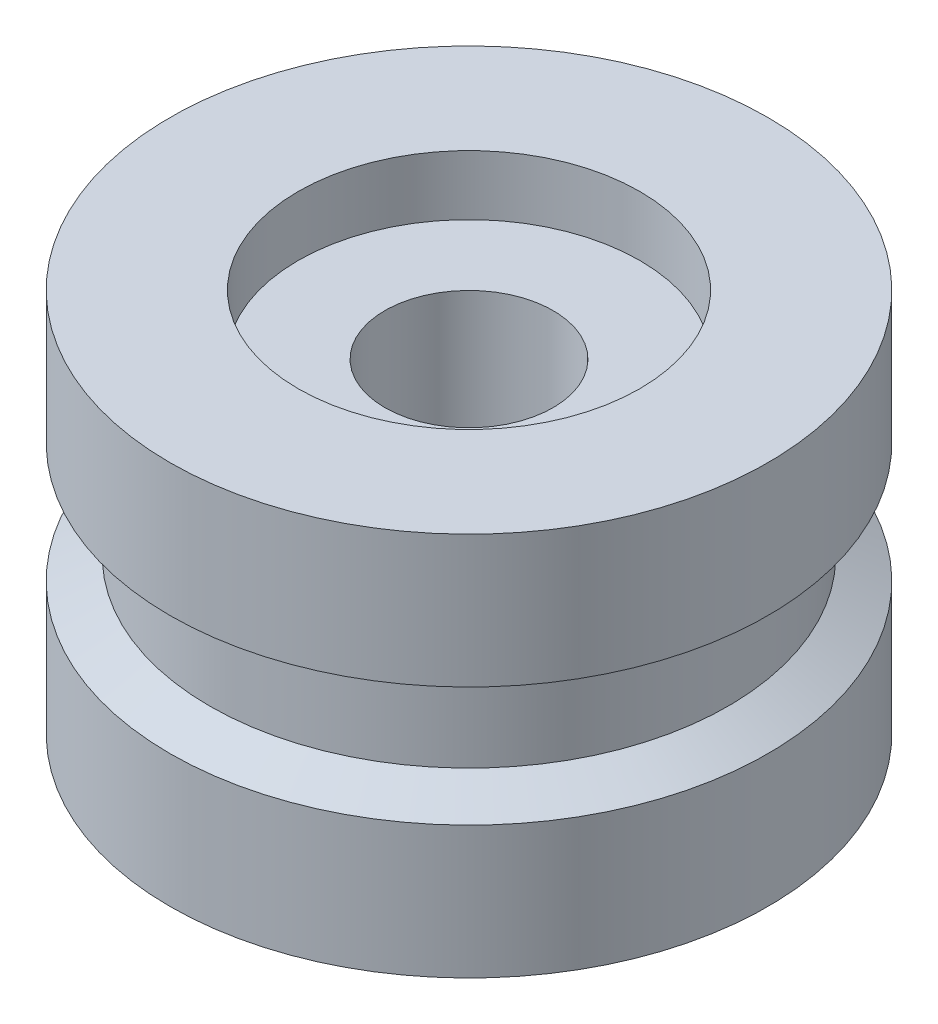
ISO-10303-21;
HEADER;
FILE_DESCRIPTION(('STEP AP214'),'2;1');
FILE_NAME('part.step','',(''),(''),'','','');
FILE_SCHEMA(('AUTOMOTIVE_DESIGN { 1 0 10303 214 1 1 1 1 }'));
ENDSEC;
DATA;
#1=APPLICATION_CONTEXT('core data for automotive mechanical design processes');
#2=APPLICATION_PROTOCOL_DEFINITION('international standard','automotive_design',2000,#1);
#3=PRODUCT_CONTEXT('',#1,'mechanical');
#4=PRODUCT('Part','Part','',(#3));
#5=PRODUCT_RELATED_PRODUCT_CATEGORY('part','',(#4));
#6=PRODUCT_DEFINITION_FORMATION('','',#4);
#7=PRODUCT_DEFINITION_CONTEXT('part definition',#1,'design');
#8=PRODUCT_DEFINITION('design','',#6,#7);
#9=PRODUCT_DEFINITION_SHAPE('','',#8);
#10=(LENGTH_UNIT() NAMED_UNIT(*) SI_UNIT(.MILLI.,.METRE.));
#11=(NAMED_UNIT(*) PLANE_ANGLE_UNIT() SI_UNIT($,.RADIAN.));
#12=(NAMED_UNIT(*) SI_UNIT($,.STERADIAN.) SOLID_ANGLE_UNIT());
#13=UNCERTAINTY_MEASURE_WITH_UNIT(LENGTH_MEASURE(1.E-05),#10,'distance_accuracy_value','');
#14=(GEOMETRIC_REPRESENTATION_CONTEXT(3) GLOBAL_UNCERTAINTY_ASSIGNED_CONTEXT((#13)) GLOBAL_UNIT_ASSIGNED_CONTEXT((#10,
#11,#12)) REPRESENTATION_CONTEXT('',''));
#15=CARTESIAN_POINT('',(0.,0.,0.));
#16=DIRECTION('',(0.,0.,1.));
#17=DIRECTION('',(1.,0.,0.));
#18=AXIS2_PLACEMENT_3D('',#15,#16,#17);
#19=CARTESIAN_POINT('',(0.,-15.5,0.));
#20=DIRECTION('',(0.,1.,0.));
#21=DIRECTION('',(0.,0.,1.));
#22=AXIS2_PLACEMENT_3D('',#19,#20,#21);
#23=PLANE('',#22);
#24=CARTESIAN_POINT('',(0.,-15.5,0.));
#25=DIRECTION('',(0.,1.,0.));
#26=DIRECTION('',(0.,0.,1.));
#27=AXIS2_PLACEMENT_3D('',#24,#25,#26);
#28=CIRCLE('',#27,9.85);
#29=CARTESIAN_POINT('',(0.,-15.5,9.85));
#30=VERTEX_POINT('',#29);
#31=EDGE_CURVE('E35',#30,#30,#28,.T.);
#32=ORIENTED_EDGE('',*,*,#31,.T.);
#33=EDGE_LOOP('',(#32));
#34=FACE_BOUND('',#33,.T.);
#35=CARTESIAN_POINT('',(0.,-15.5,0.));
#36=DIRECTION('',(0.,1.,0.));
#37=DIRECTION('',(0.,0.,1.));
#38=AXIS2_PLACEMENT_3D('',#35,#36,#37);
#39=CIRCLE('',#38,20.);
#40=CARTESIAN_POINT('',(0.,-15.5,20.));
#41=VERTEX_POINT('',#40);
#42=EDGE_CURVE('E10',#41,#41,#39,.T.);
#43=ORIENTED_EDGE('',*,*,#42,.F.);
#44=EDGE_LOOP('',(#43));
#45=FACE_BOUND('',#44,.T.);
#46=ADVANCED_FACE('F31',(#34,#45),#23,.F.);
#47=CARTESIAN_POINT('',(0.,15.5,0.));
#48=DIRECTION('',(0.,1.,0.));
#49=DIRECTION('',(0.,0.,1.));
#50=AXIS2_PLACEMENT_3D('',#47,#48,#49);
#51=PLANE('',#50);
#52=CARTESIAN_POINT('',(0.,15.5,0.));
#53=DIRECTION('',(0.,1.,0.));
#54=DIRECTION('',(0.,0.,1.));
#55=AXIS2_PLACEMENT_3D('',#52,#53,#54);
#56=CIRCLE('',#55,9.85);
#57=CARTESIAN_POINT('',(0.,15.5,9.85));
#58=VERTEX_POINT('',#57);
#59=EDGE_CURVE('E39',#58,#58,#56,.T.);
#60=ORIENTED_EDGE('',*,*,#59,.F.);
#61=EDGE_LOOP('',(#60));
#62=FACE_BOUND('',#61,.T.);
#63=CARTESIAN_POINT('',(0.,15.5,0.));
#64=DIRECTION('',(0.,1.,0.));
#65=DIRECTION('',(0.,0.,1.));
#66=AXIS2_PLACEMENT_3D('',#63,#64,#65);
#67=CIRCLE('',#66,20.);
#68=CARTESIAN_POINT('',(0.,15.5,20.));
#69=VERTEX_POINT('',#68);
#70=EDGE_CURVE('E51',#69,#69,#67,.T.);
#71=ORIENTED_EDGE('',*,*,#70,.T.);
#72=EDGE_LOOP('',(#71));
#73=FACE_BOUND('',#72,.T.);
#74=ADVANCED_FACE('F93',(#62,#73),#51,.T.);
#75=CARTESIAN_POINT('',(0.,15.5,0.));
#76=DIRECTION('',(0.,-1.,0.));
#77=DIRECTION('',(0.,0.,-1.));
#78=AXIS2_PLACEMENT_3D('',#75,#76,#77);
#79=CYLINDRICAL_SURFACE('',#78,35.);
#80=CARTESIAN_POINT('',(0.,-7.,0.));
#81=DIRECTION('',(0.,1.,0.));
#82=DIRECTION('',(0.,0.,1.));
#83=AXIS2_PLACEMENT_3D('',#80,#81,#82);
#84=CIRCLE('',#83,35.);
#85=CARTESIAN_POINT('',(0.,-7.,35.));
#86=VERTEX_POINT('',#85);
#87=EDGE_CURVE('E69',#86,#86,#84,.T.);
#88=ORIENTED_EDGE('',*,*,#87,.F.);
#89=EDGE_LOOP('',(#88));
#90=FACE_BOUND('',#89,.T.);
#91=CARTESIAN_POINT('',(0.,-22.5,0.));
#92=DIRECTION('',(0.,1.,0.));
#93=DIRECTION('',(0.,0.,1.));
#94=AXIS2_PLACEMENT_3D('',#91,#92,#93);
#95=CIRCLE('',#94,35.);
#96=CARTESIAN_POINT('',(0.,-22.5,35.));
#97=VERTEX_POINT('',#96);
#98=EDGE_CURVE('E48',#97,#97,#95,.T.);
#99=ORIENTED_EDGE('',*,*,#98,.T.);
#100=EDGE_LOOP('',(#99));
#101=FACE_BOUND('',#100,.T.);
#102=ADVANCED_FACE('F33',(#90,#101),#79,.T.);
#103=CARTESIAN_POINT('',(0.,7.,0.));
#104=DIRECTION('',(0.,1.,0.));
#105=DIRECTION('',(0.,0.,1.));
#106=AXIS2_PLACEMENT_3D('',#103,#104,#105);
#107=CIRCLE('',#106,35.);
#108=CARTESIAN_POINT('',(0.,7.,35.));
#109=VERTEX_POINT('',#108);
#110=EDGE_CURVE('E66',#109,#109,#107,.T.);
#111=ORIENTED_EDGE('',*,*,#110,.T.);
#112=EDGE_LOOP('',(#111));
#113=FACE_BOUND('',#112,.T.);
#114=CARTESIAN_POINT('',(0.,22.5,0.));
#115=DIRECTION('',(0.,1.,0.));
#116=DIRECTION('',(0.,0.,1.));
#117=AXIS2_PLACEMENT_3D('',#114,#115,#116);
#118=CIRCLE('',#117,35.);
#119=CARTESIAN_POINT('',(0.,22.5,35.));
#120=VERTEX_POINT('',#119);
#121=EDGE_CURVE('E57',#120,#120,#118,.T.);
#122=ORIENTED_EDGE('',*,*,#121,.F.);
#123=EDGE_LOOP('',(#122));
#124=FACE_BOUND('',#123,.T.);
#125=ADVANCED_FACE('F81',(#113,#124),#79,.T.);
#126=CARTESIAN_POINT('',(0.,15.5,0.));
#127=DIRECTION('',(0.,-1.,0.));
#128=DIRECTION('',(0.,0.,-1.));
#129=AXIS2_PLACEMENT_3D('',#126,#127,#128);
#130=CYLINDRICAL_SURFACE('',#129,9.85);
#131=ORIENTED_EDGE('',*,*,#59,.T.);
#132=EDGE_LOOP('',(#131));
#133=FACE_BOUND('',#132,.T.);
#134=ORIENTED_EDGE('',*,*,#31,.F.);
#135=EDGE_LOOP('',(#134));
#136=FACE_BOUND('',#135,.T.);
#137=ADVANCED_FACE('F78',(#133,#136),#130,.F.);
#138=CARTESIAN_POINT('',(0.,-4.5,0.));
#139=DIRECTION('',(0.,-1.,0.));
#140=DIRECTION('',(0.,0.,-1.));
#141=AXIS2_PLACEMENT_3D('',#138,#139,#140);
#142=CONICAL_SURFACE('',#141,30.36,1.07659795453993);
#143=ORIENTED_EDGE('',*,*,#87,.T.);
#144=EDGE_LOOP('',(#143));
#145=FACE_BOUND('',#144,.T.);
#146=CARTESIAN_POINT('',(0.,-4.5,0.));
#147=DIRECTION('',(0.,1.,0.));
#148=DIRECTION('',(0.,0.,1.));
#149=AXIS2_PLACEMENT_3D('',#146,#147,#148);
#150=CIRCLE('',#149,30.36);
#151=CARTESIAN_POINT('',(0.,-4.5,30.36));
#152=VERTEX_POINT('',#151);
#153=EDGE_CURVE('E60',#152,#152,#150,.T.);
#154=ORIENTED_EDGE('',*,*,#153,.F.);
#155=EDGE_LOOP('',(#154));
#156=FACE_BOUND('',#155,.T.);
#157=ADVANCED_FACE('F80',(#145,#156),#142,.T.);
#158=CARTESIAN_POINT('',(0.,7.,0.));
#159=DIRECTION('',(0.,1.,0.));
#160=DIRECTION('',(0.,0.,1.));
#161=AXIS2_PLACEMENT_3D('',#158,#159,#160);
#162=CONICAL_SURFACE('',#161,35.,1.07659795453993);
#163=CARTESIAN_POINT('',(0.,4.5,0.));
#164=DIRECTION('',(0.,1.,0.));
#165=DIRECTION('',(0.,0.,1.));
#166=AXIS2_PLACEMENT_3D('',#163,#164,#165);
#167=CIRCLE('',#166,30.36);
#168=CARTESIAN_POINT('',(0.,4.5,30.36));
#169=VERTEX_POINT('',#168);
#170=EDGE_CURVE('E63',#169,#169,#167,.T.);
#171=ORIENTED_EDGE('',*,*,#170,.T.);
#172=EDGE_LOOP('',(#171));
#173=FACE_BOUND('',#172,.T.);
#174=ORIENTED_EDGE('',*,*,#110,.F.);
#175=EDGE_LOOP('',(#174));
#176=FACE_BOUND('',#175,.T.);
#177=ADVANCED_FACE('F88',(#173,#176),#162,.T.);
#178=CARTESIAN_POINT('',(0.,15.5,0.));
#179=DIRECTION('',(0.,1.,0.));
#180=DIRECTION('',(0.,0.,1.));
#181=AXIS2_PLACEMENT_3D('',#178,#179,#180);
#182=CYLINDRICAL_SURFACE('',#181,30.36);
#183=ORIENTED_EDGE('',*,*,#170,.F.);
#184=EDGE_LOOP('',(#183));
#185=FACE_BOUND('',#184,.T.);
#186=ORIENTED_EDGE('',*,*,#153,.T.);
#187=EDGE_LOOP('',(#186));
#188=FACE_BOUND('',#187,.T.);
#189=ADVANCED_FACE('F119',(#185,#188),#182,.T.);
#190=CARTESIAN_POINT('',(0.,22.5,35.));
#191=DIRECTION('',(0.,1.,0.));
#192=DIRECTION('',(0.,0.,1.));
#193=AXIS2_PLACEMENT_3D('',#190,#191,#192);
#194=PLANE('',#193);
#195=ORIENTED_EDGE('',*,*,#121,.T.);
#196=EDGE_LOOP('',(#195));
#197=FACE_BOUND('',#196,.T.);
#198=CARTESIAN_POINT('',(0.,22.5,0.));
#199=DIRECTION('',(0.,1.,0.));
#200=DIRECTION('',(0.,0.,1.));
#201=AXIS2_PLACEMENT_3D('',#198,#199,#200);
#202=CIRCLE('',#201,20.);
#203=CARTESIAN_POINT('',(0.,22.5,20.));
#204=VERTEX_POINT('',#203);
#205=EDGE_CURVE('E54',#204,#204,#202,.T.);
#206=ORIENTED_EDGE('',*,*,#205,.F.);
#207=EDGE_LOOP('',(#206));
#208=FACE_BOUND('',#207,.T.);
#209=ADVANCED_FACE('F109',(#197,#208),#194,.T.);
#210=CARTESIAN_POINT('',(0.,15.5,0.));
#211=DIRECTION('',(0.,1.,0.));
#212=DIRECTION('',(0.,0.,1.));
#213=AXIS2_PLACEMENT_3D('',#210,#211,#212);
#214=CYLINDRICAL_SURFACE('',#213,20.);
#215=ORIENTED_EDGE('',*,*,#205,.T.);
#216=EDGE_LOOP('',(#215));
#217=FACE_BOUND('',#216,.T.);
#218=ORIENTED_EDGE('',*,*,#70,.F.);
#219=EDGE_LOOP('',(#218));
#220=FACE_BOUND('',#219,.T.);
#221=ADVANCED_FACE('F106',(#217,#220),#214,.F.);
#222=CARTESIAN_POINT('',(0.,-22.5,35.));
#223=DIRECTION('',(0.,-1.,0.));
#224=DIRECTION('',(0.,0.,-1.));
#225=AXIS2_PLACEMENT_3D('',#222,#223,#224);
#226=PLANE('',#225);
#227=CARTESIAN_POINT('',(0.,-22.5,0.));
#228=DIRECTION('',(0.,1.,0.));
#229=DIRECTION('',(0.,0.,1.));
#230=AXIS2_PLACEMENT_3D('',#227,#228,#229);
#231=CIRCLE('',#230,20.);
#232=CARTESIAN_POINT('',(0.,-22.5,20.));
#233=VERTEX_POINT('',#232);
#234=EDGE_CURVE('E45',#233,#233,#231,.T.);
#235=ORIENTED_EDGE('',*,*,#234,.T.);
#236=EDGE_LOOP('',(#235));
#237=FACE_BOUND('',#236,.T.);
#238=ORIENTED_EDGE('',*,*,#98,.F.);
#239=EDGE_LOOP('',(#238));
#240=FACE_BOUND('',#239,.T.);
#241=ADVANCED_FACE('F108',(#237,#240),#226,.T.);
#242=CARTESIAN_POINT('',(0.,15.5,0.));
#243=DIRECTION('',(0.,1.,0.));
#244=DIRECTION('',(0.,0.,1.));
#245=AXIS2_PLACEMENT_3D('',#242,#243,#244);
#246=CYLINDRICAL_SURFACE('',#245,20.);
#247=ORIENTED_EDGE('',*,*,#42,.T.);
#248=EDGE_LOOP('',(#247));
#249=FACE_BOUND('',#248,.T.);
#250=ORIENTED_EDGE('',*,*,#234,.F.);
#251=EDGE_LOOP('',(#250));
#252=FACE_BOUND('',#251,.T.);
#253=ADVANCED_FACE('F116',(#249,#252),#246,.F.);
#254=CLOSED_SHELL('',(#46,#74,#102,#125,#137,#157,#177,#189,#209,#221,#241,#253));
#255=MANIFOLD_SOLID_BREP('B2',#254);
#256=ADVANCED_BREP_SHAPE_REPRESENTATION('',(#18,#255),#14);
#257=SHAPE_DEFINITION_REPRESENTATION(#9,#256);
ENDSEC;
END-ISO-10303-21;
